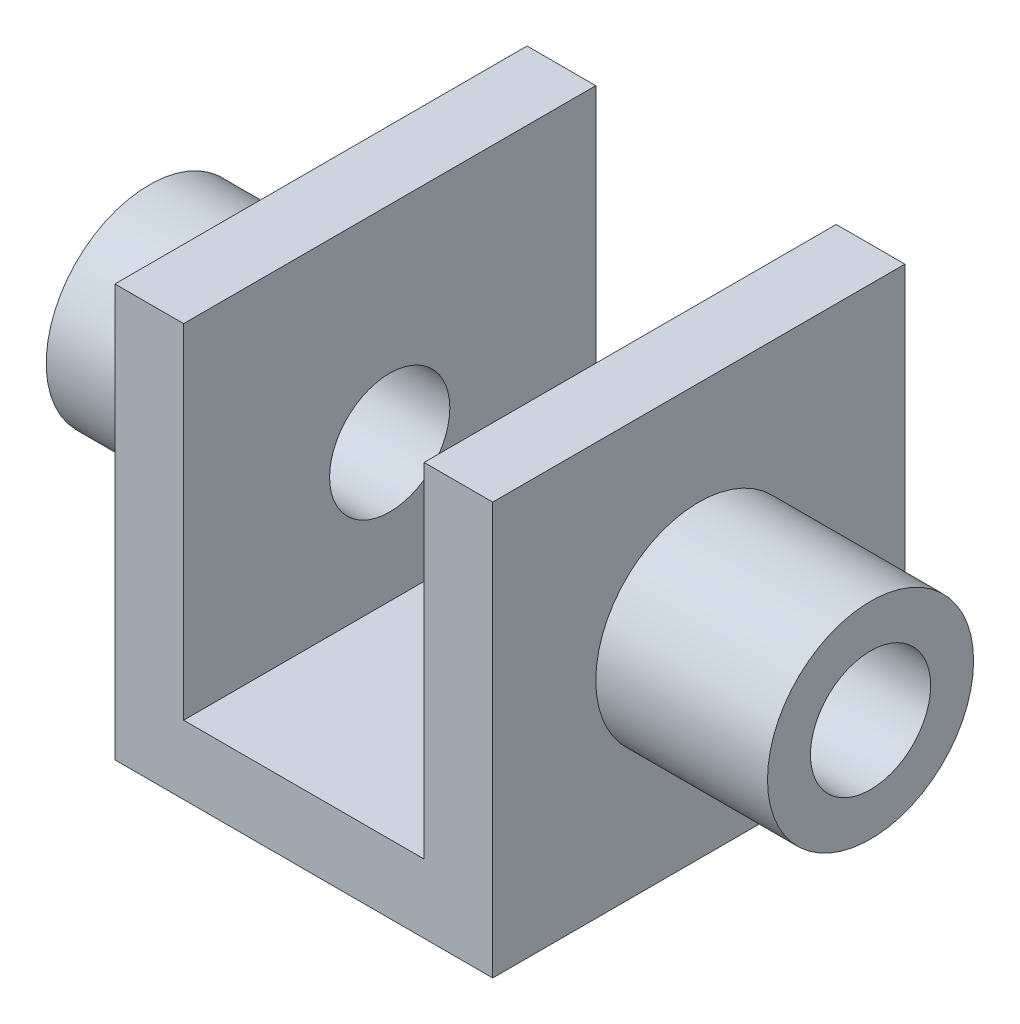
ISO-10303-21;
HEADER;
FILE_DESCRIPTION(('STEP AP214'),'2;1');
FILE_NAME('part.step','',(''),(''),'','','');
FILE_SCHEMA(('AUTOMOTIVE_DESIGN { 1 0 10303 214 1 1 1 1 }'));
ENDSEC;
DATA;
#1=APPLICATION_CONTEXT('core data for automotive mechanical design processes');
#2=APPLICATION_PROTOCOL_DEFINITION('international standard','automotive_design',2000,#1);
#3=PRODUCT_CONTEXT('',#1,'mechanical');
#4=PRODUCT('Part','Part','',(#3));
#5=PRODUCT_RELATED_PRODUCT_CATEGORY('part','',(#4));
#6=PRODUCT_DEFINITION_FORMATION('','',#4);
#7=PRODUCT_DEFINITION_CONTEXT('part definition',#1,'design');
#8=PRODUCT_DEFINITION('design','',#6,#7);
#9=PRODUCT_DEFINITION_SHAPE('','',#8);
#10=(LENGTH_UNIT() NAMED_UNIT(*) SI_UNIT(.MILLI.,.METRE.));
#11=(NAMED_UNIT(*) PLANE_ANGLE_UNIT() SI_UNIT($,.RADIAN.));
#12=(NAMED_UNIT(*) SI_UNIT($,.STERADIAN.) SOLID_ANGLE_UNIT());
#13=UNCERTAINTY_MEASURE_WITH_UNIT(LENGTH_MEASURE(1.E-05),#10,'distance_accuracy_value','');
#14=(GEOMETRIC_REPRESENTATION_CONTEXT(3) GLOBAL_UNCERTAINTY_ASSIGNED_CONTEXT((#13)) GLOBAL_UNIT_ASSIGNED_CONTEXT((#10,
#11,#12)) REPRESENTATION_CONTEXT('',''));
#15=CARTESIAN_POINT('',(0.,0.,0.));
#16=DIRECTION('',(0.,0.,1.));
#17=DIRECTION('',(1.,0.,0.));
#18=AXIS2_PLACEMENT_3D('',#15,#16,#17);
#19=CARTESIAN_POINT('',(0.,48.,24.));
#20=DIRECTION('',(1.,0.,0.));
#21=DIRECTION('',(0.,0.,-1.));
#22=AXIS2_PLACEMENT_3D('',#19,#20,#21);
#23=PLANE('',#22);
#24=CARTESIAN_POINT('',(0.,24.,0.));
#25=DIRECTION('',(1.,0.,0.));
#26=DIRECTION('',(0.,0.,-1.));
#27=AXIS2_PLACEMENT_3D('',#24,#25,#26);
#28=CIRCLE('',#27,12.);
#29=CARTESIAN_POINT('',(0.,24.,-12.));
#30=VERTEX_POINT('',#29);
#31=EDGE_CURVE('E229',#30,#30,#28,.T.);
#32=ORIENTED_EDGE('',*,*,#31,.T.);
#33=EDGE_LOOP('',(#32));
#34=FACE_BOUND('',#33,.T.);
#35=DIRECTION('',(0.,-1.,0.));
#36=VECTOR('',#35,1.);
#37=CARTESIAN_POINT('',(0.,48.,-24.));
#38=LINE('',#37,#36);
#39=CARTESIAN_POINT('',(0.,48.,-24.));
#40=VERTEX_POINT('',#39);
#41=CARTESIAN_POINT('',(0.,0.,-24.));
#42=VERTEX_POINT('',#41);
#43=EDGE_CURVE('E141',#40,#42,#38,.T.);
#44=ORIENTED_EDGE('',*,*,#43,.T.);
#45=DIRECTION('',(0.,0.,-1.));
#46=VECTOR('',#45,1.);
#47=CARTESIAN_POINT('',(0.,0.,24.));
#48=LINE('',#47,#46);
#49=CARTESIAN_POINT('',(0.,0.,24.));
#50=VERTEX_POINT('',#49);
#51=EDGE_CURVE('E48',#50,#42,#48,.T.);
#52=ORIENTED_EDGE('',*,*,#51,.F.);
#53=DIRECTION('',(0.,-1.,0.));
#54=VECTOR('',#53,1.);
#55=CARTESIAN_POINT('',(0.,48.,24.));
#56=LINE('',#55,#54);
#57=CARTESIAN_POINT('',(0.,48.,24.));
#58=VERTEX_POINT('',#57);
#59=EDGE_CURVE('E165',#58,#50,#56,.T.);
#60=ORIENTED_EDGE('',*,*,#59,.F.);
#61=DIRECTION('',(0.,0.,-1.));
#62=VECTOR('',#61,1.);
#63=CARTESIAN_POINT('',(0.,48.,24.));
#64=LINE('',#63,#62);
#65=EDGE_CURVE('E137',#58,#40,#64,.T.);
#66=ORIENTED_EDGE('',*,*,#65,.T.);
#67=EDGE_LOOP('',(#44,#52,#60,#66));
#68=FACE_BOUND('',#67,.T.);
#69=ADVANCED_FACE('F39',(#34,#68),#23,.F.);
#70=CARTESIAN_POINT('',(0.,0.,24.));
#71=DIRECTION('',(0.,1.,0.));
#72=DIRECTION('',(0.,0.,1.));
#73=AXIS2_PLACEMENT_3D('',#70,#71,#72);
#74=PLANE('',#73);
#75=DIRECTION('',(1.,0.,0.));
#76=VECTOR('',#75,1.);
#77=CARTESIAN_POINT('',(0.,0.,-24.));
#78=LINE('',#77,#76);
#79=CARTESIAN_POINT('',(44.,0.,-24.));
#80=VERTEX_POINT('',#79);
#81=EDGE_CURVE('E145',#42,#80,#78,.T.);
#82=ORIENTED_EDGE('',*,*,#81,.T.);
#83=DIRECTION('',(0.,0.,-1.));
#84=VECTOR('',#83,1.);
#85=CARTESIAN_POINT('',(44.,0.,24.));
#86=LINE('',#85,#84);
#87=CARTESIAN_POINT('',(44.,0.,24.));
#88=VERTEX_POINT('',#87);
#89=EDGE_CURVE('E180',#88,#80,#86,.T.);
#90=ORIENTED_EDGE('',*,*,#89,.F.);
#91=DIRECTION('',(1.,0.,0.));
#92=VECTOR('',#91,1.);
#93=CARTESIAN_POINT('',(0.,0.,24.));
#94=LINE('',#93,#92);
#95=EDGE_CURVE('E100',#50,#88,#94,.T.);
#96=ORIENTED_EDGE('',*,*,#95,.F.);
#97=ORIENTED_EDGE('',*,*,#51,.T.);
#98=EDGE_LOOP('',(#82,#90,#96,#97));
#99=FACE_BOUND('',#98,.T.);
#100=ADVANCED_FACE('F185',(#99),#74,.F.);
#101=CARTESIAN_POINT('',(44.,48.,24.));
#102=DIRECTION('',(-1.,0.,0.));
#103=DIRECTION('',(0.,0.,1.));
#104=AXIS2_PLACEMENT_3D('',#101,#102,#103);
#105=PLANE('',#104);
#106=CARTESIAN_POINT('',(44.,24.,0.));
#107=DIRECTION('',(-1.,0.,0.));
#108=DIRECTION('',(0.,0.,1.));
#109=AXIS2_PLACEMENT_3D('',#106,#107,#108);
#110=CIRCLE('',#109,12.);
#111=CARTESIAN_POINT('',(44.,24.,12.));
#112=VERTEX_POINT('',#111);
#113=EDGE_CURVE('E11',#112,#112,#110,.F.);
#114=ORIENTED_EDGE('',*,*,#113,.F.);
#115=EDGE_LOOP('',(#114));
#116=FACE_BOUND('',#115,.T.);
#117=DIRECTION('',(0.,1.,0.));
#118=VECTOR('',#117,1.);
#119=CARTESIAN_POINT('',(44.,48.,-24.));
#120=LINE('',#119,#118);
#121=CARTESIAN_POINT('',(44.,48.,-24.));
#122=VERTEX_POINT('',#121);
#123=EDGE_CURVE('E150',#80,#122,#120,.T.);
#124=ORIENTED_EDGE('',*,*,#123,.T.);
#125=DIRECTION('',(0.,0.,-1.));
#126=VECTOR('',#125,1.);
#127=CARTESIAN_POINT('',(44.,48.,24.));
#128=LINE('',#127,#126);
#129=CARTESIAN_POINT('',(44.,48.,24.));
#130=VERTEX_POINT('',#129);
#131=EDGE_CURVE('E176',#130,#122,#128,.T.);
#132=ORIENTED_EDGE('',*,*,#131,.F.);
#133=DIRECTION('',(0.,1.,0.));
#134=VECTOR('',#133,1.);
#135=CARTESIAN_POINT('',(44.,0.,24.));
#136=LINE('',#135,#134);
#137=EDGE_CURVE('E203',#88,#130,#136,.T.);
#138=ORIENTED_EDGE('',*,*,#137,.F.);
#139=ORIENTED_EDGE('',*,*,#89,.T.);
#140=EDGE_LOOP('',(#124,#132,#138,#139));
#141=FACE_BOUND('',#140,.T.);
#142=ADVANCED_FACE('F195',(#116,#141),#105,.F.);
#143=CARTESIAN_POINT('',(36.,48.,24.));
#144=DIRECTION('',(0.,-1.,0.));
#145=DIRECTION('',(0.,0.,-1.));
#146=AXIS2_PLACEMENT_3D('',#143,#144,#145);
#147=PLANE('',#146);
#148=DIRECTION('',(-1.,0.,0.));
#149=VECTOR('',#148,1.);
#150=CARTESIAN_POINT('',(36.,48.,-24.));
#151=LINE('',#150,#149);
#152=CARTESIAN_POINT('',(36.,48.,-24.));
#153=VERTEX_POINT('',#152);
#154=EDGE_CURVE('E153',#122,#153,#151,.T.);
#155=ORIENTED_EDGE('',*,*,#154,.T.);
#156=DIRECTION('',(0.,0.,-1.));
#157=VECTOR('',#156,1.);
#158=CARTESIAN_POINT('',(36.,48.,24.));
#159=LINE('',#158,#157);
#160=CARTESIAN_POINT('',(36.,48.,24.));
#161=VERTEX_POINT('',#160);
#162=EDGE_CURVE('E172',#161,#153,#159,.T.);
#163=ORIENTED_EDGE('',*,*,#162,.F.);
#164=DIRECTION('',(-1.,0.,0.));
#165=VECTOR('',#164,1.);
#166=CARTESIAN_POINT('',(36.,48.,24.));
#167=LINE('',#166,#165);
#168=EDGE_CURVE('E201',#130,#161,#167,.T.);
#169=ORIENTED_EDGE('',*,*,#168,.F.);
#170=ORIENTED_EDGE('',*,*,#131,.T.);
#171=EDGE_LOOP('',(#155,#163,#169,#170));
#172=FACE_BOUND('',#171,.T.);
#173=ADVANCED_FACE('F199',(#172),#147,.F.);
#174=CARTESIAN_POINT('',(36.,8.,24.));
#175=DIRECTION('',(1.,0.,0.));
#176=DIRECTION('',(0.,0.,-1.));
#177=AXIS2_PLACEMENT_3D('',#174,#175,#176);
#178=PLANE('',#177);
#179=CARTESIAN_POINT('',(36.,24.,0.));
#180=DIRECTION('',(1.,0.,0.));
#181=DIRECTION('',(0.,0.,-1.));
#182=AXIS2_PLACEMENT_3D('',#179,#180,#181);
#183=CIRCLE('',#182,7.);
#184=CARTESIAN_POINT('',(36.,24.,-7.));
#185=VERTEX_POINT('',#184);
#186=EDGE_CURVE('E220',#185,#185,#183,.T.);
#187=ORIENTED_EDGE('',*,*,#186,.T.);
#188=EDGE_LOOP('',(#187));
#189=FACE_BOUND('',#188,.T.);
#190=DIRECTION('',(0.,-1.,0.));
#191=VECTOR('',#190,1.);
#192=CARTESIAN_POINT('',(36.,8.,-24.));
#193=LINE('',#192,#191);
#194=CARTESIAN_POINT('',(36.,8.,-24.));
#195=VERTEX_POINT('',#194);
#196=EDGE_CURVE('E156',#153,#195,#193,.T.);
#197=ORIENTED_EDGE('',*,*,#196,.T.);
#198=DIRECTION('',(0.,0.,-1.));
#199=VECTOR('',#198,1.);
#200=CARTESIAN_POINT('',(36.,8.,24.));
#201=LINE('',#200,#199);
#202=CARTESIAN_POINT('',(36.,8.,24.));
#203=VERTEX_POINT('',#202);
#204=EDGE_CURVE('E130',#203,#195,#201,.T.);
#205=ORIENTED_EDGE('',*,*,#204,.F.);
#206=DIRECTION('',(0.,-1.,0.));
#207=VECTOR('',#206,1.);
#208=CARTESIAN_POINT('',(36.,8.,24.));
#209=LINE('',#208,#207);
#210=EDGE_CURVE('E119',#161,#203,#209,.T.);
#211=ORIENTED_EDGE('',*,*,#210,.F.);
#212=ORIENTED_EDGE('',*,*,#162,.T.);
#213=EDGE_LOOP('',(#197,#205,#211,#212));
#214=FACE_BOUND('',#213,.T.);
#215=ADVANCED_FACE('F275',(#189,#214),#178,.F.);
#216=CARTESIAN_POINT('',(8.,8.,24.));
#217=DIRECTION('',(0.,-1.,0.));
#218=DIRECTION('',(0.,0.,-1.));
#219=AXIS2_PLACEMENT_3D('',#216,#217,#218);
#220=PLANE('',#219);
#221=DIRECTION('',(-1.,0.,0.));
#222=VECTOR('',#221,1.);
#223=CARTESIAN_POINT('',(8.,8.,-24.));
#224=LINE('',#223,#222);
#225=CARTESIAN_POINT('',(8.,8.,-24.));
#226=VERTEX_POINT('',#225);
#227=EDGE_CURVE('E128',#195,#226,#224,.T.);
#228=ORIENTED_EDGE('',*,*,#227,.T.);
#229=DIRECTION('',(0.,0.,-1.));
#230=VECTOR('',#229,1.);
#231=CARTESIAN_POINT('',(8.,8.,24.));
#232=LINE('',#231,#230);
#233=CARTESIAN_POINT('',(8.,8.,24.));
#234=VERTEX_POINT('',#233);
#235=EDGE_CURVE('E125',#234,#226,#232,.T.);
#236=ORIENTED_EDGE('',*,*,#235,.F.);
#237=DIRECTION('',(-1.,0.,0.));
#238=VECTOR('',#237,1.);
#239=CARTESIAN_POINT('',(8.,8.,24.));
#240=LINE('',#239,#238);
#241=EDGE_CURVE('E113',#203,#234,#240,.T.);
#242=ORIENTED_EDGE('',*,*,#241,.F.);
#243=ORIENTED_EDGE('',*,*,#204,.T.);
#244=EDGE_LOOP('',(#228,#236,#242,#243));
#245=FACE_BOUND('',#244,.T.);
#246=ADVANCED_FACE('F126',(#245),#220,.F.);
#247=CARTESIAN_POINT('',(8.,8.,24.));
#248=DIRECTION('',(-1.,0.,0.));
#249=DIRECTION('',(0.,0.,1.));
#250=AXIS2_PLACEMENT_3D('',#247,#248,#249);
#251=PLANE('',#250);
#252=CARTESIAN_POINT('',(8.,24.,0.));
#253=DIRECTION('',(-1.,0.,0.));
#254=DIRECTION('',(0.,0.,1.));
#255=AXIS2_PLACEMENT_3D('',#252,#253,#254);
#256=CIRCLE('',#255,7.);
#257=CARTESIAN_POINT('',(8.,24.,7.));
#258=VERTEX_POINT('',#257);
#259=EDGE_CURVE('E224',#258,#258,#256,.T.);
#260=ORIENTED_EDGE('',*,*,#259,.T.);
#261=EDGE_LOOP('',(#260));
#262=FACE_BOUND('',#261,.T.);
#263=DIRECTION('',(0.,1.,0.));
#264=VECTOR('',#263,1.);
#265=CARTESIAN_POINT('',(8.,8.,-24.));
#266=LINE('',#265,#264);
#267=CARTESIAN_POINT('',(8.,48.,-24.));
#268=VERTEX_POINT('',#267);
#269=EDGE_CURVE('E85',#226,#268,#266,.T.);
#270=ORIENTED_EDGE('',*,*,#269,.T.);
#271=DIRECTION('',(0.,0.,-1.));
#272=VECTOR('',#271,1.);
#273=CARTESIAN_POINT('',(8.,48.,24.));
#274=LINE('',#273,#272);
#275=CARTESIAN_POINT('',(8.,48.,24.));
#276=VERTEX_POINT('',#275);
#277=EDGE_CURVE('E131',#276,#268,#274,.T.);
#278=ORIENTED_EDGE('',*,*,#277,.F.);
#279=DIRECTION('',(0.,1.,0.));
#280=VECTOR('',#279,1.);
#281=CARTESIAN_POINT('',(8.,8.,24.));
#282=LINE('',#281,#280);
#283=EDGE_CURVE('E117',#234,#276,#282,.T.);
#284=ORIENTED_EDGE('',*,*,#283,.F.);
#285=ORIENTED_EDGE('',*,*,#235,.T.);
#286=EDGE_LOOP('',(#270,#278,#284,#285));
#287=FACE_BOUND('',#286,.T.);
#288=ADVANCED_FACE('F133',(#262,#287),#251,.F.);
#289=CARTESIAN_POINT('',(8.,48.,24.));
#290=DIRECTION('',(0.,-1.,0.));
#291=DIRECTION('',(0.,0.,-1.));
#292=AXIS2_PLACEMENT_3D('',#289,#290,#291);
#293=PLANE('',#292);
#294=DIRECTION('',(-1.,0.,0.));
#295=VECTOR('',#294,1.);
#296=CARTESIAN_POINT('',(8.,48.,-24.));
#297=LINE('',#296,#295);
#298=EDGE_CURVE('E91',#268,#40,#297,.T.);
#299=ORIENTED_EDGE('',*,*,#298,.T.);
#300=ORIENTED_EDGE('',*,*,#65,.F.);
#301=DIRECTION('',(-1.,0.,0.));
#302=VECTOR('',#301,1.);
#303=CARTESIAN_POINT('',(8.,48.,24.));
#304=LINE('',#303,#302);
#305=EDGE_CURVE('E56',#276,#58,#304,.T.);
#306=ORIENTED_EDGE('',*,*,#305,.F.);
#307=ORIENTED_EDGE('',*,*,#277,.T.);
#308=EDGE_LOOP('',(#299,#300,#306,#307));
#309=FACE_BOUND('',#308,.T.);
#310=ADVANCED_FACE('F283',(#309),#293,.F.);
#311=CARTESIAN_POINT('',(0.,0.,24.));
#312=DIRECTION('',(0.,0.,1.));
#313=DIRECTION('',(1.,0.,0.));
#314=AXIS2_PLACEMENT_3D('',#311,#312,#313);
#315=PLANE('',#314);
#316=ORIENTED_EDGE('',*,*,#59,.T.);
#317=ORIENTED_EDGE('',*,*,#95,.T.);
#318=ORIENTED_EDGE('',*,*,#137,.T.);
#319=ORIENTED_EDGE('',*,*,#168,.T.);
#320=ORIENTED_EDGE('',*,*,#210,.T.);
#321=ORIENTED_EDGE('',*,*,#241,.T.);
#322=ORIENTED_EDGE('',*,*,#283,.T.);
#323=ORIENTED_EDGE('',*,*,#305,.T.);
#324=EDGE_LOOP('',(#316,#317,#318,#319,#320,#321,#322,#323));
#325=FACE_BOUND('',#324,.T.);
#326=ADVANCED_FACE('F115',(#325),#315,.T.);
#327=CARTESIAN_POINT('',(0.,0.,-24.));
#328=DIRECTION('',(0.,0.,1.));
#329=DIRECTION('',(1.,0.,0.));
#330=AXIS2_PLACEMENT_3D('',#327,#328,#329);
#331=PLANE('',#330);
#332=ORIENTED_EDGE('',*,*,#43,.F.);
#333=ORIENTED_EDGE('',*,*,#298,.F.);
#334=ORIENTED_EDGE('',*,*,#269,.F.);
#335=ORIENTED_EDGE('',*,*,#227,.F.);
#336=ORIENTED_EDGE('',*,*,#196,.F.);
#337=ORIENTED_EDGE('',*,*,#154,.F.);
#338=ORIENTED_EDGE('',*,*,#123,.F.);
#339=ORIENTED_EDGE('',*,*,#81,.F.);
#340=EDGE_LOOP('',(#332,#333,#334,#335,#336,#337,#338,#339));
#341=FACE_BOUND('',#340,.T.);
#342=ADVANCED_FACE('F190',(#341),#331,.F.);
#343=CARTESIAN_POINT('',(64.,24.,0.));
#344=DIRECTION('',(1.,0.,0.));
#345=DIRECTION('',(0.,0.,-1.));
#346=AXIS2_PLACEMENT_3D('',#343,#344,#345);
#347=PLANE('',#346);
#348=CARTESIAN_POINT('',(64.,24.,0.));
#349=DIRECTION('',(1.,0.,0.));
#350=DIRECTION('',(0.,0.,-1.));
#351=AXIS2_PLACEMENT_3D('',#348,#349,#350);
#352=CIRCLE('',#351,12.);
#353=CARTESIAN_POINT('',(64.,24.,-12.));
#354=VERTEX_POINT('',#353);
#355=EDGE_CURVE('E146',#354,#354,#352,.T.);
#356=ORIENTED_EDGE('',*,*,#355,.T.);
#357=EDGE_LOOP('',(#356));
#358=FACE_BOUND('',#357,.T.);
#359=CARTESIAN_POINT('',(64.,24.,0.));
#360=DIRECTION('',(1.,0.,0.));
#361=DIRECTION('',(0.,0.,-1.));
#362=AXIS2_PLACEMENT_3D('',#359,#360,#361);
#363=CIRCLE('',#362,7.);
#364=CARTESIAN_POINT('',(64.,24.,-7.));
#365=VERTEX_POINT('',#364);
#366=EDGE_CURVE('E216',#365,#365,#363,.T.);
#367=ORIENTED_EDGE('',*,*,#366,.F.);
#368=EDGE_LOOP('',(#367));
#369=FACE_BOUND('',#368,.T.);
#370=ADVANCED_FACE('F289',(#358,#369),#347,.T.);
#371=CARTESIAN_POINT('',(64.,24.,0.));
#372=DIRECTION('',(-1.,0.,0.));
#373=DIRECTION('',(0.,0.,1.));
#374=AXIS2_PLACEMENT_3D('',#371,#372,#373);
#375=CYLINDRICAL_SURFACE('',#374,12.);
#376=ORIENTED_EDGE('',*,*,#355,.F.);
#377=EDGE_LOOP('',(#376));
#378=FACE_BOUND('',#377,.T.);
#379=ORIENTED_EDGE('',*,*,#113,.T.);
#380=EDGE_LOOP('',(#379));
#381=FACE_BOUND('',#380,.T.);
#382=ADVANCED_FACE('F256',(#378,#381),#375,.T.);
#383=CARTESIAN_POINT('',(64.,24.,0.));
#384=DIRECTION('',(-1.,0.,0.));
#385=DIRECTION('',(0.,0.,1.));
#386=AXIS2_PLACEMENT_3D('',#383,#384,#385);
#387=CYLINDRICAL_SURFACE('',#386,7.);
#388=ORIENTED_EDGE('',*,*,#366,.T.);
#389=EDGE_LOOP('',(#388));
#390=FACE_BOUND('',#389,.T.);
#391=ORIENTED_EDGE('',*,*,#186,.F.);
#392=EDGE_LOOP('',(#391));
#393=FACE_BOUND('',#392,.T.);
#394=ADVANCED_FACE('F247',(#390,#393),#387,.F.);
#395=CARTESIAN_POINT('',(0.,24.,0.));
#396=DIRECTION('',(1.,0.,0.));
#397=DIRECTION('',(0.,0.,-1.));
#398=AXIS2_PLACEMENT_3D('',#395,#396,#397);
#399=CYLINDRICAL_SURFACE('',#398,7.);
#400=ORIENTED_EDGE('',*,*,#259,.F.);
#401=EDGE_LOOP('',(#400));
#402=FACE_BOUND('',#401,.T.);
#403=CARTESIAN_POINT('',(-20.,24.,0.));
#404=DIRECTION('',(1.,0.,0.));
#405=DIRECTION('',(0.,0.,-1.));
#406=AXIS2_PLACEMENT_3D('',#403,#404,#405);
#407=CIRCLE('',#406,7.);
#408=CARTESIAN_POINT('',(-20.,24.,-7.));
#409=VERTEX_POINT('',#408);
#410=EDGE_CURVE('E233',#409,#409,#407,.T.);
#411=ORIENTED_EDGE('',*,*,#410,.F.);
#412=EDGE_LOOP('',(#411));
#413=FACE_BOUND('',#412,.T.);
#414=ADVANCED_FACE('F244',(#402,#413),#399,.F.);
#415=CARTESIAN_POINT('',(-20.,24.,0.));
#416=DIRECTION('',(1.,0.,0.));
#417=DIRECTION('',(0.,0.,-1.));
#418=AXIS2_PLACEMENT_3D('',#415,#416,#417);
#419=CYLINDRICAL_SURFACE('',#418,12.);
#420=CARTESIAN_POINT('',(-20.,24.,0.));
#421=DIRECTION('',(1.,0.,0.));
#422=DIRECTION('',(0.,0.,-1.));
#423=AXIS2_PLACEMENT_3D('',#420,#421,#422);
#424=CIRCLE('',#423,12.);
#425=CARTESIAN_POINT('',(-20.,24.,-12.));
#426=VERTEX_POINT('',#425);
#427=EDGE_CURVE('E228',#426,#426,#424,.T.);
#428=ORIENTED_EDGE('',*,*,#427,.T.);
#429=EDGE_LOOP('',(#428));
#430=FACE_BOUND('',#429,.T.);
#431=ORIENTED_EDGE('',*,*,#31,.F.);
#432=EDGE_LOOP('',(#431));
#433=FACE_BOUND('',#432,.T.);
#434=ADVANCED_FACE('F246',(#430,#433),#419,.T.);
#435=CARTESIAN_POINT('',(-20.,24.,0.));
#436=DIRECTION('',(-1.,0.,0.));
#437=DIRECTION('',(0.,0.,-1.));
#438=AXIS2_PLACEMENT_3D('',#435,#436,#437);
#439=PLANE('',#438);
#440=ORIENTED_EDGE('',*,*,#410,.T.);
#441=EDGE_LOOP('',(#440));
#442=FACE_BOUND('',#441,.T.);
#443=ORIENTED_EDGE('',*,*,#427,.F.);
#444=EDGE_LOOP('',(#443));
#445=FACE_BOUND('',#444,.T.);
#446=ADVANCED_FACE('F241',(#442,#445),#439,.T.);
#447=CLOSED_SHELL('',(#69,#100,#142,#173,#215,#246,#288,#310,#326,#342,#370,#382,#394,#414,#434,#446));
#448=MANIFOLD_SOLID_BREP('B2',#447);
#449=ADVANCED_BREP_SHAPE_REPRESENTATION('',(#18,#448),#14);
#450=SHAPE_DEFINITION_REPRESENTATION(#9,#449);
ENDSEC;
END-ISO-10303-21;
